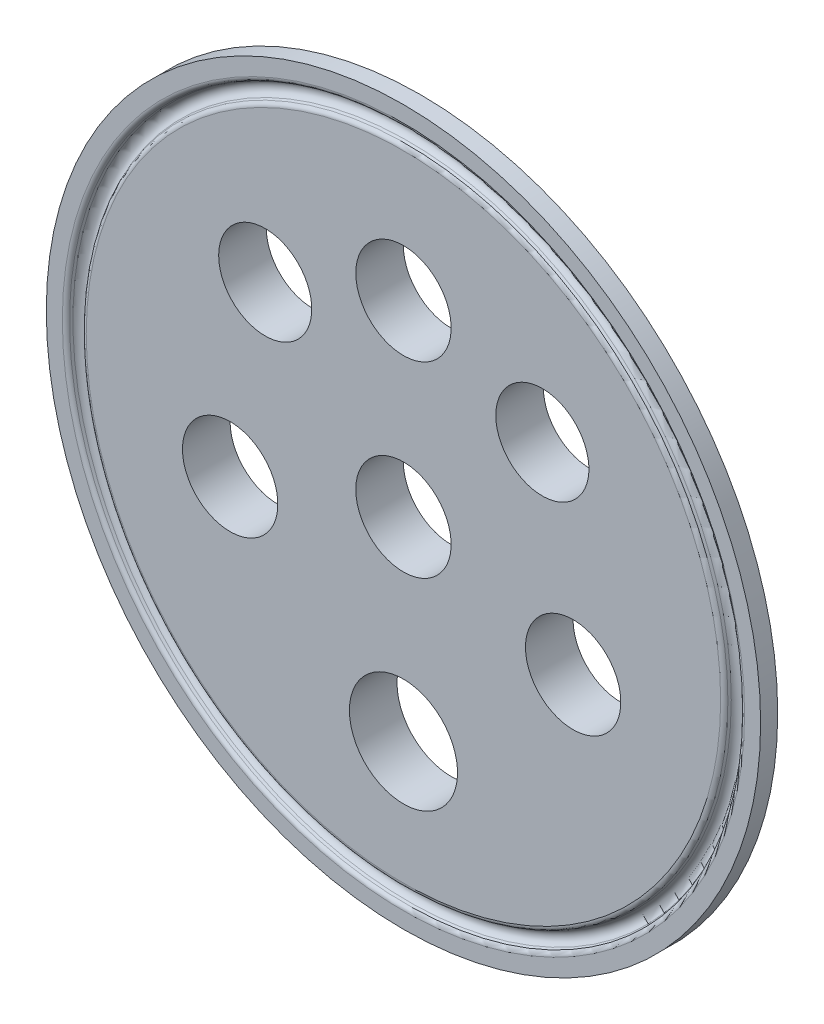
ISO-10303-21;
HEADER;
FILE_DESCRIPTION(('STEP AP214'),'2;1');
FILE_NAME('part.step','',(''),(''),'','','');
FILE_SCHEMA(('AUTOMOTIVE_DESIGN { 1 0 10303 214 1 1 1 1 }'));
ENDSEC;
DATA;
#1=APPLICATION_CONTEXT('core data for automotive mechanical design processes');
#2=APPLICATION_PROTOCOL_DEFINITION('international standard','automotive_design',2000,#1);
#3=PRODUCT_CONTEXT('',#1,'mechanical');
#4=PRODUCT('Part','Part','',(#3));
#5=PRODUCT_RELATED_PRODUCT_CATEGORY('part','',(#4));
#6=PRODUCT_DEFINITION_FORMATION('','',#4);
#7=PRODUCT_DEFINITION_CONTEXT('part definition',#1,'design');
#8=PRODUCT_DEFINITION('design','',#6,#7);
#9=PRODUCT_DEFINITION_SHAPE('','',#8);
#10=(LENGTH_UNIT() NAMED_UNIT(*) SI_UNIT(.MILLI.,.METRE.));
#11=(NAMED_UNIT(*) PLANE_ANGLE_UNIT() SI_UNIT($,.RADIAN.));
#12=(NAMED_UNIT(*) SI_UNIT($,.STERADIAN.) SOLID_ANGLE_UNIT());
#13=UNCERTAINTY_MEASURE_WITH_UNIT(LENGTH_MEASURE(1.E-05),#10,'distance_accuracy_value','');
#14=(GEOMETRIC_REPRESENTATION_CONTEXT(3) GLOBAL_UNCERTAINTY_ASSIGNED_CONTEXT((#13)) GLOBAL_UNIT_ASSIGNED_CONTEXT((#10,
#11,#12)) REPRESENTATION_CONTEXT('',''));
#15=CARTESIAN_POINT('',(0.,0.,0.));
#16=DIRECTION('',(0.,0.,1.));
#17=DIRECTION('',(1.,0.,0.));
#18=AXIS2_PLACEMENT_3D('',#15,#16,#17);
#19=CARTESIAN_POINT('',(0.,45.5042147091706,-7.9248));
#20=DIRECTION('',(0.,0.,1.));
#21=DIRECTION('',(1.,0.,0.));
#22=AXIS2_PLACEMENT_3D('',#19,#20,#21);
#23=PLANE('',#22);
#24=CARTESIAN_POINT('',(-23.0149023280899,22.3295744319601,-7.9248));
#25=DIRECTION('',(0.,0.,-1.));
#26=DIRECTION('',(-1.,0.,0.));
#27=AXIS2_PLACEMENT_3D('',#24,#25,#26);
#28=CIRCLE('',#27,7.75);
#29=CARTESIAN_POINT('',(-30.7649023280899,22.3295744319601,-7.9248));
#30=VERTEX_POINT('',#29);
#31=EDGE_CURVE('E94',#30,#30,#28,.T.);
#32=ORIENTED_EDGE('',*,*,#31,.F.);
#33=EDGE_LOOP('',(#32));
#34=FACE_BOUND('',#33,.T.);
#35=CARTESIAN_POINT('',(0.,31.1980578942988,-7.9248));
#36=DIRECTION('',(0.,0.,-1.));
#37=DIRECTION('',(-1.,0.,0.));
#38=AXIS2_PLACEMENT_3D('',#35,#36,#37);
#39=CIRCLE('',#38,7.9375);
#40=CARTESIAN_POINT('',(-7.9375,31.1980578942988,-7.9248));
#41=VERTEX_POINT('',#40);
#42=EDGE_CURVE('E122',#41,#41,#39,.T.);
#43=ORIENTED_EDGE('',*,*,#42,.F.);
#44=EDGE_LOOP('',(#43));
#45=FACE_BOUND('',#44,.T.);
#46=CARTESIAN_POINT('',(28.2480993997503,-8.61422720878899,-7.9248));
#47=DIRECTION('',(0.,0.,-1.));
#48=DIRECTION('',(-1.,0.,0.));
#49=AXIS2_PLACEMENT_3D('',#46,#47,#48);
#50=CIRCLE('',#49,7.9375);
#51=CARTESIAN_POINT('',(20.3105993997503,-8.61422720878899,-7.9248));
#52=VERTEX_POINT('',#51);
#53=EDGE_CURVE('E130',#52,#52,#50,.T.);
#54=ORIENTED_EDGE('',*,*,#53,.F.);
#55=EDGE_LOOP('',(#54));
#56=FACE_BOUND('',#55,.T.);
#57=CARTESIAN_POINT('',(0.,0.,-7.9248));
#58=DIRECTION('',(0.,0.,-1.));
#59=DIRECTION('',(-1.,0.,0.));
#60=AXIS2_PLACEMENT_3D('',#57,#58,#59);
#61=CIRCLE('',#60,7.9375);
#62=CARTESIAN_POINT('',(-7.9375,0.,-7.9248));
#63=VERTEX_POINT('',#62);
#64=EDGE_CURVE('E139',#63,#63,#61,.T.);
#65=ORIENTED_EDGE('',*,*,#64,.F.);
#66=EDGE_LOOP('',(#65));
#67=FACE_BOUND('',#66,.T.);
#68=CARTESIAN_POINT('',(0.,-32.3777277986259,-7.9248));
#69=DIRECTION('',(0.,0.,-1.));
#70=DIRECTION('',(-1.,0.,0.));
#71=AXIS2_PLACEMENT_3D('',#68,#69,#70);
#72=CIRCLE('',#71,9.);
#73=CARTESIAN_POINT('',(-9.,-32.3777277986259,-7.9248));
#74=VERTEX_POINT('',#73);
#75=EDGE_CURVE('E146',#74,#74,#72,.T.);
#76=ORIENTED_EDGE('',*,*,#75,.F.);
#77=EDGE_LOOP('',(#76));
#78=FACE_BOUND('',#77,.T.);
#79=CARTESIAN_POINT('',(-28.8509979094132,-8.61422720878899,-7.9248));
#80=DIRECTION('',(0.,0.,-1.));
#81=DIRECTION('',(-1.,0.,0.));
#82=AXIS2_PLACEMENT_3D('',#79,#80,#81);
#83=CIRCLE('',#82,7.9375);
#84=CARTESIAN_POINT('',(-36.7884979094132,-8.61422720878899,-7.9248));
#85=VERTEX_POINT('',#84);
#86=EDGE_CURVE('E101',#85,#85,#83,.T.);
#87=ORIENTED_EDGE('',*,*,#86,.F.);
#88=EDGE_LOOP('',(#87));
#89=FACE_BOUND('',#88,.T.);
#90=CARTESIAN_POINT('',(23.121403312526,22.3295744319601,-7.9248));
#91=DIRECTION('',(0.,0.,-1.));
#92=DIRECTION('',(-1.,0.,0.));
#93=AXIS2_PLACEMENT_3D('',#90,#91,#92);
#94=CIRCLE('',#93,7.75);
#95=CARTESIAN_POINT('',(15.371403312526,22.3295744319601,-7.9248));
#96=VERTEX_POINT('',#95);
#97=EDGE_CURVE('E89',#96,#96,#94,.T.);
#98=ORIENTED_EDGE('',*,*,#97,.F.);
#99=EDGE_LOOP('',(#98));
#100=FACE_BOUND('',#99,.T.);
#101=CARTESIAN_POINT('',(0.,0.,-7.9248));
#102=DIRECTION('',(0.,0.,1.));
#103=DIRECTION('',(1.,0.,0.));
#104=AXIS2_PLACEMENT_3D('',#101,#102,#103);
#105=CIRCLE('',#104,45.5042147091706);
#106=CARTESIAN_POINT('',(45.5042147091706,0.,-7.9248));
#107=VERTEX_POINT('',#106);
#108=EDGE_CURVE('E11',#107,#107,#105,.T.);
#109=ORIENTED_EDGE('',*,*,#108,.F.);
#110=EDGE_LOOP('',(#109));
#111=FACE_BOUND('',#110,.T.);
#112=ADVANCED_FACE('F44',(#34,#45,#56,#67,#78,#89,#100,#111),#23,.F.);
#113=CARTESIAN_POINT('',(0.,0.,-7.9248));
#114=DIRECTION('',(0.,0.,1.));
#115=DIRECTION('',(1.,0.,0.));
#116=AXIS2_PLACEMENT_3D('',#113,#114,#115);
#117=CONICAL_SURFACE('',#116,45.5042147091706,1.22173047639603);
#118=CARTESIAN_POINT('',(0.,0.,-2.8448));
#119=DIRECTION('',(0.,0.,1.));
#120=DIRECTION('',(1.,0.,0.));
#121=AXIS2_PLACEMENT_3D('',#118,#119,#120);
#122=CIRCLE('',#121,59.4614);
#123=CARTESIAN_POINT('',(59.4614,0.,-2.8448));
#124=VERTEX_POINT('',#123);
#125=EDGE_CURVE('E52',#124,#124,#122,.T.);
#126=ORIENTED_EDGE('',*,*,#125,.F.);
#127=EDGE_LOOP('',(#126));
#128=FACE_BOUND('',#127,.T.);
#129=ORIENTED_EDGE('',*,*,#108,.T.);
#130=EDGE_LOOP('',(#129));
#131=FACE_BOUND('',#130,.T.);
#132=ADVANCED_FACE('F177',(#128,#131),#117,.T.);
#133=CARTESIAN_POINT('',(0.,0.,0.));
#134=DIRECTION('',(0.,0.,1.));
#135=DIRECTION('',(1.,0.,0.));
#136=AXIS2_PLACEMENT_3D('',#133,#134,#135);
#137=CYLINDRICAL_SURFACE('',#136,59.4614);
#138=CARTESIAN_POINT('',(0.,0.,0.));
#139=DIRECTION('',(0.,0.,1.));
#140=DIRECTION('',(1.,0.,0.));
#141=AXIS2_PLACEMENT_3D('',#138,#139,#140);
#142=CIRCLE('',#141,59.4614);
#143=CARTESIAN_POINT('',(59.4614,0.,0.));
#144=VERTEX_POINT('',#143);
#145=EDGE_CURVE('E57',#144,#144,#142,.T.);
#146=ORIENTED_EDGE('',*,*,#145,.F.);
#147=EDGE_LOOP('',(#146));
#148=FACE_BOUND('',#147,.T.);
#149=ORIENTED_EDGE('',*,*,#125,.T.);
#150=EDGE_LOOP('',(#149));
#151=FACE_BOUND('',#150,.T.);
#152=ADVANCED_FACE('F184',(#148,#151),#137,.T.);
#153=CARTESIAN_POINT('',(0.,56.7910722747395,0.));
#154=DIRECTION('',(0.,0.,-1.));
#155=DIRECTION('',(-1.,0.,0.));
#156=AXIS2_PLACEMENT_3D('',#153,#154,#155);
#157=PLANE('',#156);
#158=CARTESIAN_POINT('',(0.,0.,0.));
#159=DIRECTION('',(0.,0.,1.));
#160=DIRECTION('',(1.,0.,0.));
#161=AXIS2_PLACEMENT_3D('',#158,#159,#160);
#162=CIRCLE('',#161,56.7910722747395);
#163=CARTESIAN_POINT('',(56.7910722747395,0.,0.));
#164=VERTEX_POINT('',#163);
#165=EDGE_CURVE('E62',#164,#164,#162,.T.);
#166=ORIENTED_EDGE('',*,*,#165,.F.);
#167=EDGE_LOOP('',(#166));
#168=FACE_BOUND('',#167,.T.);
#169=ORIENTED_EDGE('',*,*,#145,.T.);
#170=EDGE_LOOP('',(#169));
#171=FACE_BOUND('',#170,.T.);
#172=ADVANCED_FACE('F230',(#168,#171),#157,.F.);
#173=CARTESIAN_POINT('',(0.,0.,-0.7874));
#174=DIRECTION('',(0.,0.,1.));
#175=DIRECTION('',(1.,0.,0.));
#176=AXIS2_PLACEMENT_3D('',#173,#174,#175);
#177=TOROIDAL_SURFACE('',#176,56.7910722747395,0.7874);
#178=CARTESIAN_POINT('',(0.,0.,-0.479738309427547));
#179=DIRECTION('',(0.,0.,1.));
#180=DIRECTION('',(1.,0.,0.));
#181=AXIS2_PLACEMENT_3D('',#178,#179,#180);
#182=CIRCLE('',#181,56.0662667531311);
#183=CARTESIAN_POINT('',(56.0662667531311,0.,-0.479738309427547));
#184=VERTEX_POINT('',#183);
#185=EDGE_CURVE('E68',#184,#184,#182,.T.);
#186=ORIENTED_EDGE('',*,*,#185,.F.);
#187=EDGE_LOOP('',(#186));
#188=FACE_BOUND('',#187,.T.);
#189=ORIENTED_EDGE('',*,*,#165,.T.);
#190=EDGE_LOOP('',(#189));
#191=FACE_BOUND('',#190,.T.);
#192=ADVANCED_FACE('F226',(#188,#191),#177,.T.);
#193=CARTESIAN_POINT('',(0.,0.,-0.479738309427547));
#194=DIRECTION('',(0.,0.,1.));
#195=DIRECTION('',(1.,0.,0.));
#196=AXIS2_PLACEMENT_3D('',#193,#194,#195);
#197=CONICAL_SURFACE('',#196,56.0662667531311,0.401425727958702);
#198=CARTESIAN_POINT('',(0.,0.,-0.872854821190493));
#199=DIRECTION('',(0.,0.,1.));
#200=DIRECTION('',(1.,0.,0.));
#201=AXIS2_PLACEMENT_3D('',#198,#199,#200);
#202=CIRCLE('',#201,55.8993986940515);
#203=CARTESIAN_POINT('',(55.8993986940515,0.,-0.872854821190493));
#204=VERTEX_POINT('',#203);
#205=EDGE_CURVE('E72',#204,#204,#202,.T.);
#206=ORIENTED_EDGE('',*,*,#205,.F.);
#207=EDGE_LOOP('',(#206));
#208=FACE_BOUND('',#207,.T.);
#209=ORIENTED_EDGE('',*,*,#185,.T.);
#210=EDGE_LOOP('',(#209));
#211=FACE_BOUND('',#210,.T.);
#212=ADVANCED_FACE('F222',(#208,#211),#197,.F.);
#213=CARTESIAN_POINT('',(0.,0.,-0.4064));
#214=DIRECTION('',(0.,0.,1.));
#215=DIRECTION('',(1.,0.,0.));
#216=AXIS2_PLACEMENT_3D('',#213,#214,#215);
#217=TOROIDAL_SURFACE('',#216,54.8005,1.1938);
#218=CARTESIAN_POINT('',(0.,0.,-0.872854821190503));
#219=DIRECTION('',(0.,0.,1.));
#220=DIRECTION('',(1.,0.,0.));
#221=AXIS2_PLACEMENT_3D('',#218,#219,#220);
#222=CIRCLE('',#221,53.7016013059485);
#223=CARTESIAN_POINT('',(53.7016013059485,0.,-0.872854821190503));
#224=VERTEX_POINT('',#223);
#225=EDGE_CURVE('E76',#224,#224,#222,.T.);
#226=ORIENTED_EDGE('',*,*,#225,.F.);
#227=EDGE_LOOP('',(#226));
#228=FACE_BOUND('',#227,.T.);
#229=ORIENTED_EDGE('',*,*,#205,.T.);
#230=EDGE_LOOP('',(#229));
#231=FACE_BOUND('',#230,.T.);
#232=ADVANCED_FACE('F218',(#228,#231),#217,.F.);
#233=CARTESIAN_POINT('',(0.,0.,-0.872854821190503));
#234=DIRECTION('',(0.,0.,-1.));
#235=DIRECTION('',(-1.,0.,0.));
#236=AXIS2_PLACEMENT_3D('',#233,#234,#235);
#237=CONICAL_SURFACE('',#236,53.7016013059485,0.401425727958718);
#238=CARTESIAN_POINT('',(0.,0.,-0.479738309427541));
#239=DIRECTION('',(0.,0.,1.));
#240=DIRECTION('',(1.,0.,0.));
#241=AXIS2_PLACEMENT_3D('',#238,#239,#240);
#242=CIRCLE('',#241,53.5347332468689);
#243=CARTESIAN_POINT('',(53.5347332468689,0.,-0.479738309427541));
#244=VERTEX_POINT('',#243);
#245=EDGE_CURVE('E80',#244,#244,#242,.T.);
#246=ORIENTED_EDGE('',*,*,#245,.F.);
#247=EDGE_LOOP('',(#246));
#248=FACE_BOUND('',#247,.T.);
#249=ORIENTED_EDGE('',*,*,#225,.T.);
#250=EDGE_LOOP('',(#249));
#251=FACE_BOUND('',#250,.T.);
#252=ADVANCED_FACE('F214',(#248,#251),#237,.T.);
#253=CARTESIAN_POINT('',(0.,0.,-0.7874));
#254=DIRECTION('',(0.,0.,1.));
#255=DIRECTION('',(1.,0.,0.));
#256=AXIS2_PLACEMENT_3D('',#253,#254,#255);
#257=TOROIDAL_SURFACE('',#256,52.8099277252605,0.787400000000005);
#258=CARTESIAN_POINT('',(0.,0.,0.));
#259=DIRECTION('',(0.,0.,1.));
#260=DIRECTION('',(1.,0.,0.));
#261=AXIS2_PLACEMENT_3D('',#258,#259,#260);
#262=CIRCLE('',#261,52.8099277252605);
#263=CARTESIAN_POINT('',(52.8099277252605,0.,0.));
#264=VERTEX_POINT('',#263);
#265=EDGE_CURVE('E84',#264,#264,#262,.T.);
#266=ORIENTED_EDGE('',*,*,#265,.F.);
#267=EDGE_LOOP('',(#266));
#268=FACE_BOUND('',#267,.T.);
#269=ORIENTED_EDGE('',*,*,#245,.T.);
#270=EDGE_LOOP('',(#269));
#271=FACE_BOUND('',#270,.T.);
#272=ADVANCED_FACE('F206',(#268,#271),#257,.T.);
#273=CARTESIAN_POINT('',(0.,0.,0.));
#274=DIRECTION('',(0.,0.,-1.));
#275=DIRECTION('',(-1.,0.,0.));
#276=AXIS2_PLACEMENT_3D('',#273,#274,#275);
#277=PLANE('',#276);
#278=CARTESIAN_POINT('',(-23.0149023280899,22.3295744319601,0.));
#279=DIRECTION('',(0.,0.,-1.));
#280=DIRECTION('',(-1.,0.,0.));
#281=AXIS2_PLACEMENT_3D('',#278,#279,#280);
#282=CIRCLE('',#281,7.75);
#283=CARTESIAN_POINT('',(-30.7649023280899,22.3295744319601,0.));
#284=VERTEX_POINT('',#283);
#285=EDGE_CURVE('E116',#284,#284,#282,.T.);
#286=ORIENTED_EDGE('',*,*,#285,.T.);
#287=EDGE_LOOP('',(#286));
#288=FACE_BOUND('',#287,.T.);
#289=CARTESIAN_POINT('',(0.,31.1980578942988,0.));
#290=DIRECTION('',(0.,0.,-1.));
#291=DIRECTION('',(-1.,0.,0.));
#292=AXIS2_PLACEMENT_3D('',#289,#290,#291);
#293=CIRCLE('',#292,7.9375);
#294=CARTESIAN_POINT('',(-7.9375,31.1980578942988,0.));
#295=VERTEX_POINT('',#294);
#296=EDGE_CURVE('E127',#295,#295,#293,.T.);
#297=ORIENTED_EDGE('',*,*,#296,.T.);
#298=EDGE_LOOP('',(#297));
#299=FACE_BOUND('',#298,.T.);
#300=CARTESIAN_POINT('',(28.2480993997503,-8.61422720878899,0.));
#301=DIRECTION('',(0.,0.,-1.));
#302=DIRECTION('',(-1.,0.,0.));
#303=AXIS2_PLACEMENT_3D('',#300,#301,#302);
#304=CIRCLE('',#303,7.9375);
#305=CARTESIAN_POINT('',(20.3105993997503,-8.61422720878899,0.));
#306=VERTEX_POINT('',#305);
#307=EDGE_CURVE('E135',#306,#306,#304,.T.);
#308=ORIENTED_EDGE('',*,*,#307,.T.);
#309=EDGE_LOOP('',(#308));
#310=FACE_BOUND('',#309,.T.);
#311=CARTESIAN_POINT('',(0.,0.,0.));
#312=DIRECTION('',(0.,0.,-1.));
#313=DIRECTION('',(-1.,0.,0.));
#314=AXIS2_PLACEMENT_3D('',#311,#312,#313);
#315=CIRCLE('',#314,7.9375);
#316=CARTESIAN_POINT('',(-7.9375,0.,0.));
#317=VERTEX_POINT('',#316);
#318=EDGE_CURVE('E143',#317,#317,#315,.T.);
#319=ORIENTED_EDGE('',*,*,#318,.T.);
#320=EDGE_LOOP('',(#319));
#321=FACE_BOUND('',#320,.T.);
#322=CARTESIAN_POINT('',(0.,-32.3777277986259,0.));
#323=DIRECTION('',(0.,0.,-1.));
#324=DIRECTION('',(-1.,0.,0.));
#325=AXIS2_PLACEMENT_3D('',#322,#323,#324);
#326=CIRCLE('',#325,9.);
#327=CARTESIAN_POINT('',(-9.,-32.3777277986259,0.));
#328=VERTEX_POINT('',#327);
#329=EDGE_CURVE('E107',#328,#328,#326,.T.);
#330=ORIENTED_EDGE('',*,*,#329,.T.);
#331=EDGE_LOOP('',(#330));
#332=FACE_BOUND('',#331,.T.);
#333=CARTESIAN_POINT('',(-28.8509979094132,-8.61422720878899,0.));
#334=DIRECTION('',(0.,0.,-1.));
#335=DIRECTION('',(-1.,0.,0.));
#336=AXIS2_PLACEMENT_3D('',#333,#334,#335);
#337=CIRCLE('',#336,7.9375);
#338=CARTESIAN_POINT('',(-36.7884979094132,-8.61422720878899,0.));
#339=VERTEX_POINT('',#338);
#340=EDGE_CURVE('E108',#339,#339,#337,.T.);
#341=ORIENTED_EDGE('',*,*,#340,.T.);
#342=EDGE_LOOP('',(#341));
#343=FACE_BOUND('',#342,.T.);
#344=CARTESIAN_POINT('',(23.121403312526,22.3295744319601,0.));
#345=DIRECTION('',(0.,0.,-1.));
#346=DIRECTION('',(-1.,0.,0.));
#347=AXIS2_PLACEMENT_3D('',#344,#345,#346);
#348=CIRCLE('',#347,7.75);
#349=CARTESIAN_POINT('',(15.371403312526,22.3295744319601,0.));
#350=VERTEX_POINT('',#349);
#351=EDGE_CURVE('E88',#350,#350,#348,.T.);
#352=ORIENTED_EDGE('',*,*,#351,.T.);
#353=EDGE_LOOP('',(#352));
#354=FACE_BOUND('',#353,.T.);
#355=ORIENTED_EDGE('',*,*,#265,.T.);
#356=EDGE_LOOP('',(#355));
#357=FACE_BOUND('',#356,.T.);
#358=ADVANCED_FACE('F158',(#288,#299,#310,#321,#332,#343,#354,#357),#277,.F.);
#359=CARTESIAN_POINT('',(23.121403312526,22.3295744319601,0.));
#360=DIRECTION('',(0.,0.,-1.));
#361=DIRECTION('',(-1.,0.,0.));
#362=AXIS2_PLACEMENT_3D('',#359,#360,#361);
#363=CYLINDRICAL_SURFACE('',#362,7.75);
#364=ORIENTED_EDGE('',*,*,#351,.F.);
#365=EDGE_LOOP('',(#364));
#366=FACE_BOUND('',#365,.T.);
#367=ORIENTED_EDGE('',*,*,#97,.T.);
#368=EDGE_LOOP('',(#367));
#369=FACE_BOUND('',#368,.T.);
#370=ADVANCED_FACE('F173',(#366,#369),#363,.F.);
#371=CARTESIAN_POINT('',(-28.8509979094132,-8.61422720878899,0.));
#372=DIRECTION('',(0.,0.,-1.));
#373=DIRECTION('',(-1.,0.,0.));
#374=AXIS2_PLACEMENT_3D('',#371,#372,#373);
#375=CYLINDRICAL_SURFACE('',#374,7.9375);
#376=ORIENTED_EDGE('',*,*,#340,.F.);
#377=EDGE_LOOP('',(#376));
#378=FACE_BOUND('',#377,.T.);
#379=ORIENTED_EDGE('',*,*,#86,.T.);
#380=EDGE_LOOP('',(#379));
#381=FACE_BOUND('',#380,.T.);
#382=ADVANCED_FACE('F164',(#378,#381),#375,.F.);
#383=CARTESIAN_POINT('',(0.,-32.3777277986259,0.));
#384=DIRECTION('',(0.,0.,-1.));
#385=DIRECTION('',(-1.,0.,0.));
#386=AXIS2_PLACEMENT_3D('',#383,#384,#385);
#387=CYLINDRICAL_SURFACE('',#386,9.);
#388=ORIENTED_EDGE('',*,*,#329,.F.);
#389=EDGE_LOOP('',(#388));
#390=FACE_BOUND('',#389,.T.);
#391=ORIENTED_EDGE('',*,*,#75,.T.);
#392=EDGE_LOOP('',(#391));
#393=FACE_BOUND('',#392,.T.);
#394=ADVANCED_FACE('F161',(#390,#393),#387,.F.);
#395=CARTESIAN_POINT('',(0.,0.,0.));
#396=DIRECTION('',(0.,0.,-1.));
#397=DIRECTION('',(-1.,0.,0.));
#398=AXIS2_PLACEMENT_3D('',#395,#396,#397);
#399=CYLINDRICAL_SURFACE('',#398,7.9375);
#400=ORIENTED_EDGE('',*,*,#318,.F.);
#401=EDGE_LOOP('',(#400));
#402=FACE_BOUND('',#401,.T.);
#403=ORIENTED_EDGE('',*,*,#64,.T.);
#404=EDGE_LOOP('',(#403));
#405=FACE_BOUND('',#404,.T.);
#406=ADVANCED_FACE('F163',(#402,#405),#399,.F.);
#407=CARTESIAN_POINT('',(28.2480993997503,-8.61422720878899,0.));
#408=DIRECTION('',(0.,0.,-1.));
#409=DIRECTION('',(-1.,0.,0.));
#410=AXIS2_PLACEMENT_3D('',#407,#408,#409);
#411=CYLINDRICAL_SURFACE('',#410,7.9375);
#412=ORIENTED_EDGE('',*,*,#307,.F.);
#413=EDGE_LOOP('',(#412));
#414=FACE_BOUND('',#413,.T.);
#415=ORIENTED_EDGE('',*,*,#53,.T.);
#416=EDGE_LOOP('',(#415));
#417=FACE_BOUND('',#416,.T.);
#418=ADVANCED_FACE('F170',(#414,#417),#411,.F.);
#419=CARTESIAN_POINT('',(0.,31.1980578942988,0.));
#420=DIRECTION('',(0.,0.,-1.));
#421=DIRECTION('',(-1.,0.,0.));
#422=AXIS2_PLACEMENT_3D('',#419,#420,#421);
#423=CYLINDRICAL_SURFACE('',#422,7.9375);
#424=ORIENTED_EDGE('',*,*,#296,.F.);
#425=EDGE_LOOP('',(#424));
#426=FACE_BOUND('',#425,.T.);
#427=ORIENTED_EDGE('',*,*,#42,.T.);
#428=EDGE_LOOP('',(#427));
#429=FACE_BOUND('',#428,.T.);
#430=ADVANCED_FACE('F303',(#426,#429),#423,.F.);
#431=CARTESIAN_POINT('',(-23.0149023280899,22.3295744319601,0.));
#432=DIRECTION('',(0.,0.,-1.));
#433=DIRECTION('',(-1.,0.,0.));
#434=AXIS2_PLACEMENT_3D('',#431,#432,#433);
#435=CYLINDRICAL_SURFACE('',#434,7.75);
#436=ORIENTED_EDGE('',*,*,#285,.F.);
#437=EDGE_LOOP('',(#436));
#438=FACE_BOUND('',#437,.T.);
#439=ORIENTED_EDGE('',*,*,#31,.T.);
#440=EDGE_LOOP('',(#439));
#441=FACE_BOUND('',#440,.T.);
#442=ADVANCED_FACE('F313',(#438,#441),#435,.F.);
#443=CLOSED_SHELL('',(#112,#132,#152,#172,#192,#212,#232,#252,#272,#358,#370,#382,#394,#406,
#418,#430,#442));
#444=MANIFOLD_SOLID_BREP('B2',#443);
#445=ADVANCED_BREP_SHAPE_REPRESENTATION('',(#18,#444),#14);
#446=SHAPE_DEFINITION_REPRESENTATION(#9,#445);
ENDSEC;
END-ISO-10303-21;
